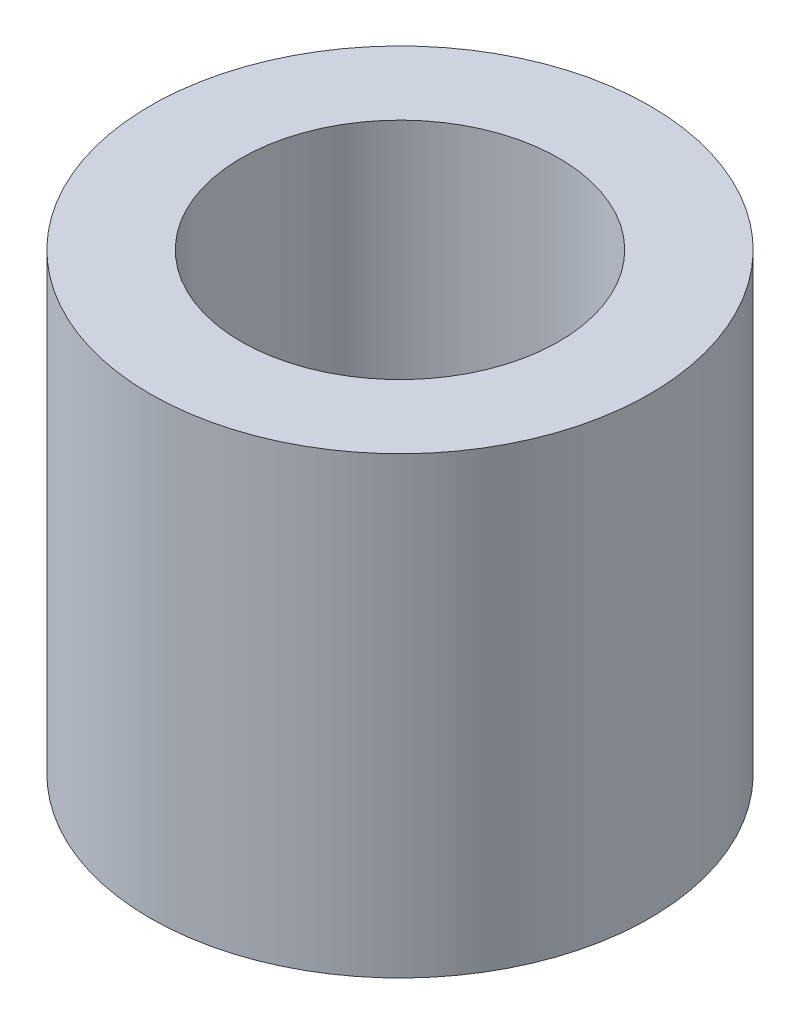
ISO-10303-21;
HEADER;
FILE_DESCRIPTION(('STEP AP214'),'2;1');
FILE_NAME('part.step','',(''),(''),'','','');
FILE_SCHEMA(('AUTOMOTIVE_DESIGN { 1 0 10303 214 1 1 1 1 }'));
ENDSEC;
DATA;
#1=APPLICATION_CONTEXT('core data for automotive mechanical design processes');
#2=APPLICATION_PROTOCOL_DEFINITION('international standard','automotive_design',2000,#1);
#3=PRODUCT_CONTEXT('',#1,'mechanical');
#4=PRODUCT('Part','Part','',(#3));
#5=PRODUCT_RELATED_PRODUCT_CATEGORY('part','',(#4));
#6=PRODUCT_DEFINITION_FORMATION('','',#4);
#7=PRODUCT_DEFINITION_CONTEXT('part definition',#1,'design');
#8=PRODUCT_DEFINITION('design','',#6,#7);
#9=PRODUCT_DEFINITION_SHAPE('','',#8);
#10=(LENGTH_UNIT() NAMED_UNIT(*) SI_UNIT(.MILLI.,.METRE.));
#11=(NAMED_UNIT(*) PLANE_ANGLE_UNIT() SI_UNIT($,.RADIAN.));
#12=(NAMED_UNIT(*) SI_UNIT($,.STERADIAN.) SOLID_ANGLE_UNIT());
#13=UNCERTAINTY_MEASURE_WITH_UNIT(LENGTH_MEASURE(1.E-05),#10,'distance_accuracy_value','');
#14=(GEOMETRIC_REPRESENTATION_CONTEXT(3) GLOBAL_UNCERTAINTY_ASSIGNED_CONTEXT((#13)) GLOBAL_UNIT_ASSIGNED_CONTEXT((#10,
#11,#12)) REPRESENTATION_CONTEXT('',''));
#15=CARTESIAN_POINT('',(0.,0.,0.));
#16=DIRECTION('',(0.,0.,1.));
#17=DIRECTION('',(1.,0.,0.));
#18=AXIS2_PLACEMENT_3D('',#15,#16,#17);
#19=CARTESIAN_POINT('',(0.,5.,0.));
#20=DIRECTION('',(0.,1.,0.));
#21=DIRECTION('',(0.,0.,1.));
#22=AXIS2_PLACEMENT_3D('',#19,#20,#21);
#23=PLANE('',#22);
#24=CARTESIAN_POINT('',(0.,5.,0.));
#25=DIRECTION('',(0.,1.,0.));
#26=DIRECTION('',(0.,0.,1.));
#27=AXIS2_PLACEMENT_3D('',#24,#25,#26);
#28=CIRCLE('',#27,2.75);
#29=CARTESIAN_POINT('',(0.,5.,2.75));
#30=VERTEX_POINT('',#29);
#31=EDGE_CURVE('E10',#30,#30,#28,.T.);
#32=ORIENTED_EDGE('',*,*,#31,.T.);
#33=EDGE_LOOP('',(#32));
#34=FACE_BOUND('',#33,.T.);
#35=CARTESIAN_POINT('',(0.,5.,0.));
#36=DIRECTION('',(0.,1.,0.));
#37=DIRECTION('',(0.,0.,1.));
#38=AXIS2_PLACEMENT_3D('',#35,#36,#37);
#39=CIRCLE('',#38,1.75);
#40=CARTESIAN_POINT('',(0.,5.,1.75));
#41=VERTEX_POINT('',#40);
#42=EDGE_CURVE('E50',#41,#41,#39,.T.);
#43=ORIENTED_EDGE('',*,*,#42,.F.);
#44=EDGE_LOOP('',(#43));
#45=FACE_BOUND('',#44,.T.);
#46=ADVANCED_FACE('F37',(#34,#45),#23,.T.);
#47=CARTESIAN_POINT('',(0.,0.,0.));
#48=DIRECTION('',(0.,1.,0.));
#49=DIRECTION('',(0.,0.,1.));
#50=AXIS2_PLACEMENT_3D('',#47,#48,#49);
#51=PLANE('',#50);
#52=CARTESIAN_POINT('',(0.,0.,0.));
#53=DIRECTION('',(0.,1.,0.));
#54=DIRECTION('',(0.,0.,1.));
#55=AXIS2_PLACEMENT_3D('',#52,#53,#54);
#56=CIRCLE('',#55,2.75);
#57=CARTESIAN_POINT('',(0.,0.,2.75));
#58=VERTEX_POINT('',#57);
#59=EDGE_CURVE('E41',#58,#58,#56,.T.);
#60=ORIENTED_EDGE('',*,*,#59,.F.);
#61=EDGE_LOOP('',(#60));
#62=FACE_BOUND('',#61,.T.);
#63=CARTESIAN_POINT('',(0.,0.,0.));
#64=DIRECTION('',(0.,1.,0.));
#65=DIRECTION('',(0.,0.,1.));
#66=AXIS2_PLACEMENT_3D('',#63,#64,#65);
#67=CIRCLE('',#66,1.75);
#68=CARTESIAN_POINT('',(0.,0.,1.75));
#69=VERTEX_POINT('',#68);
#70=EDGE_CURVE('E52',#69,#69,#67,.T.);
#71=ORIENTED_EDGE('',*,*,#70,.T.);
#72=EDGE_LOOP('',(#71));
#73=FACE_BOUND('',#72,.T.);
#74=ADVANCED_FACE('F64',(#62,#73),#51,.F.);
#75=CARTESIAN_POINT('',(0.,5.,0.));
#76=DIRECTION('',(0.,-1.,0.));
#77=DIRECTION('',(0.,0.,-1.));
#78=AXIS2_PLACEMENT_3D('',#75,#76,#77);
#79=CYLINDRICAL_SURFACE('',#78,2.75);
#80=ORIENTED_EDGE('',*,*,#31,.F.);
#81=EDGE_LOOP('',(#80));
#82=FACE_BOUND('',#81,.T.);
#83=ORIENTED_EDGE('',*,*,#59,.T.);
#84=EDGE_LOOP('',(#83));
#85=FACE_BOUND('',#84,.T.);
#86=ADVANCED_FACE('F39',(#82,#85),#79,.T.);
#87=CARTESIAN_POINT('',(0.,5.,0.));
#88=DIRECTION('',(0.,-1.,0.));
#89=DIRECTION('',(0.,0.,-1.));
#90=AXIS2_PLACEMENT_3D('',#87,#88,#89);
#91=CYLINDRICAL_SURFACE('',#90,1.75);
#92=ORIENTED_EDGE('',*,*,#42,.T.);
#93=EDGE_LOOP('',(#92));
#94=FACE_BOUND('',#93,.T.);
#95=ORIENTED_EDGE('',*,*,#70,.F.);
#96=EDGE_LOOP('',(#95));
#97=FACE_BOUND('',#96,.T.);
#98=ADVANCED_FACE('F60',(#94,#97),#91,.F.);
#99=CLOSED_SHELL('',(#46,#74,#86,#98));
#100=MANIFOLD_SOLID_BREP('B2',#99);
#101=ADVANCED_BREP_SHAPE_REPRESENTATION('',(#18,#100),#14);
#102=SHAPE_DEFINITION_REPRESENTATION(#9,#101);
ENDSEC;
END-ISO-10303-21;
